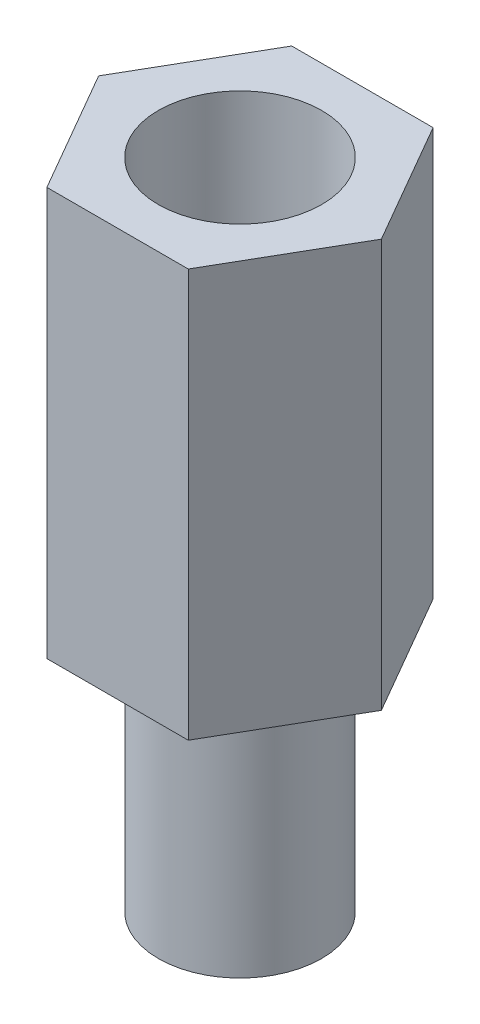
ISO-10303-21;
HEADER;
FILE_DESCRIPTION(('STEP AP214'),'2;1');
FILE_NAME('part.step','',(''),(''),'','','');
FILE_SCHEMA(('AUTOMOTIVE_DESIGN { 1 0 10303 214 1 1 1 1 }'));
ENDSEC;
DATA;
#1=APPLICATION_CONTEXT('core data for automotive mechanical design processes');
#2=APPLICATION_PROTOCOL_DEFINITION('international standard','automotive_design',2000,#1);
#3=PRODUCT_CONTEXT('',#1,'mechanical');
#4=PRODUCT('Part','Part','',(#3));
#5=PRODUCT_RELATED_PRODUCT_CATEGORY('part','',(#4));
#6=PRODUCT_DEFINITION_FORMATION('','',#4);
#7=PRODUCT_DEFINITION_CONTEXT('part definition',#1,'design');
#8=PRODUCT_DEFINITION('design','',#6,#7);
#9=PRODUCT_DEFINITION_SHAPE('','',#8);
#10=(LENGTH_UNIT() NAMED_UNIT(*) SI_UNIT(.MILLI.,.METRE.));
#11=(NAMED_UNIT(*) PLANE_ANGLE_UNIT() SI_UNIT($,.RADIAN.));
#12=(NAMED_UNIT(*) SI_UNIT($,.STERADIAN.) SOLID_ANGLE_UNIT());
#13=UNCERTAINTY_MEASURE_WITH_UNIT(LENGTH_MEASURE(1.E-05),#10,'distance_accuracy_value','');
#14=(GEOMETRIC_REPRESENTATION_CONTEXT(3) GLOBAL_UNCERTAINTY_ASSIGNED_CONTEXT((#13)) GLOBAL_UNIT_ASSIGNED_CONTEXT((#10,
#11,#12)) REPRESENTATION_CONTEXT('',''));
#15=CARTESIAN_POINT('',(0.,0.,0.));
#16=DIRECTION('',(0.,0.,1.));
#17=DIRECTION('',(1.,0.,0.));
#18=AXIS2_PLACEMENT_3D('',#15,#16,#17);
#19=CARTESIAN_POINT('',(0.,-6.,0.));
#20=DIRECTION('',(0.,1.,0.));
#21=DIRECTION('',(0.,0.,1.));
#22=AXIS2_PLACEMENT_3D('',#19,#20,#21);
#23=CYLINDRICAL_SURFACE('',#22,2.);
#24=CARTESIAN_POINT('',(0.,-6.,0.));
#25=DIRECTION('',(0.,1.,0.));
#26=DIRECTION('',(0.,0.,1.));
#27=AXIS2_PLACEMENT_3D('',#24,#25,#26);
#28=CIRCLE('',#27,2.);
#29=CARTESIAN_POINT('',(0.,-6.,2.));
#30=VERTEX_POINT('',#29);
#31=EDGE_CURVE('E11',#30,#30,#28,.T.);
#32=ORIENTED_EDGE('',*,*,#31,.T.);
#33=EDGE_LOOP('',(#32));
#34=FACE_BOUND('',#33,.T.);
#35=CARTESIAN_POINT('',(0.,0.,0.));
#36=DIRECTION('',(0.,1.,0.));
#37=DIRECTION('',(0.,0.,1.));
#38=AXIS2_PLACEMENT_3D('',#35,#36,#37);
#39=CIRCLE('',#38,2.);
#40=CARTESIAN_POINT('',(0.,0.,2.));
#41=VERTEX_POINT('',#40);
#42=EDGE_CURVE('E50',#41,#41,#39,.T.);
#43=ORIENTED_EDGE('',*,*,#42,.F.);
#44=EDGE_LOOP('',(#43));
#45=FACE_BOUND('',#44,.T.);
#46=ADVANCED_FACE('F47',(#34,#45),#23,.T.);
#47=CARTESIAN_POINT('',(0.,-6.,0.));
#48=DIRECTION('',(0.,1.,0.));
#49=DIRECTION('',(0.,0.,1.));
#50=AXIS2_PLACEMENT_3D('',#47,#48,#49);
#51=PLANE('',#50);
#52=ORIENTED_EDGE('',*,*,#31,.F.);
#53=EDGE_LOOP('',(#52));
#54=FACE_BOUND('',#53,.T.);
#55=ADVANCED_FACE('F62',(#54),#51,.F.);
#56=CARTESIAN_POINT('',(0.,0.,0.));
#57=DIRECTION('',(0.,1.,0.));
#58=DIRECTION('',(0.,0.,1.));
#59=AXIS2_PLACEMENT_3D('',#56,#57,#58);
#60=PLANE('',#59);
#61=ORIENTED_EDGE('',*,*,#42,.T.);
#62=EDGE_LOOP('',(#61));
#63=FACE_BOUND('',#62,.T.);
#64=ADVANCED_FACE('F59',(#63),#60,.T.);
#65=CLOSED_SHELL('',(#46,#55,#64));
#66=MANIFOLD_SOLID_BREP('B2',#65);
#67=CARTESIAN_POINT('',(0.,10.,0.));
#68=DIRECTION('',(0.,1.,0.));
#69=DIRECTION('',(0.,0.,1.));
#70=AXIS2_PLACEMENT_3D('',#67,#68,#69);
#71=PLANE('',#70);
#72=DIRECTION('',(0.5,0.,-0.866025403784439));
#73=VECTOR('',#72,1.);
#74=CARTESIAN_POINT('',(1.73205080756889,10.,3.));
#75=LINE('',#74,#73);
#76=CARTESIAN_POINT('',(1.73205080756889,10.,3.));
#77=VERTEX_POINT('',#76);
#78=CARTESIAN_POINT('',(3.46410161513776,10.,0.));
#79=VERTEX_POINT('',#78);
#80=EDGE_CURVE('E195',#77,#79,#75,.T.);
#81=ORIENTED_EDGE('',*,*,#80,.T.);
#82=DIRECTION('',(-0.499999999999999,0.,-0.866025403784439));
#83=VECTOR('',#82,1.);
#84=CARTESIAN_POINT('',(3.46410161513776,10.,0.));
#85=LINE('',#84,#83);
#86=CARTESIAN_POINT('',(1.73205080756888,10.,-3.));
#87=VERTEX_POINT('',#86);
#88=EDGE_CURVE('E143',#79,#87,#85,.T.);
#89=ORIENTED_EDGE('',*,*,#88,.T.);
#90=DIRECTION('',(-1.,0.,0.));
#91=VECTOR('',#90,1.);
#92=CARTESIAN_POINT('',(1.73205080756888,10.,-3.));
#93=LINE('',#92,#91);
#94=CARTESIAN_POINT('',(-1.73205080756888,10.,-3.));
#95=VERTEX_POINT('',#94);
#96=EDGE_CURVE('E156',#87,#95,#93,.T.);
#97=ORIENTED_EDGE('',*,*,#96,.T.);
#98=DIRECTION('',(-0.500000000000001,0.,0.866025403784438));
#99=VECTOR('',#98,1.);
#100=CARTESIAN_POINT('',(-1.73205080756888,10.,-3.));
#101=LINE('',#100,#99);
#102=CARTESIAN_POINT('',(-3.46410161513776,10.,0.));
#103=VERTEX_POINT('',#102);
#104=EDGE_CURVE('E150',#95,#103,#101,.T.);
#105=ORIENTED_EDGE('',*,*,#104,.T.);
#106=DIRECTION('',(0.5,0.,0.866025403784439));
#107=VECTOR('',#106,1.);
#108=CARTESIAN_POINT('',(-3.46410161513776,10.,0.));
#109=LINE('',#108,#107);
#110=CARTESIAN_POINT('',(-1.73205080756888,10.,3.));
#111=VERTEX_POINT('',#110);
#112=EDGE_CURVE('E154',#103,#111,#109,.T.);
#113=ORIENTED_EDGE('',*,*,#112,.T.);
#114=DIRECTION('',(1.,0.,0.));
#115=VECTOR('',#114,1.);
#116=CARTESIAN_POINT('',(-1.73205080756888,10.,3.));
#117=LINE('',#116,#115);
#118=EDGE_CURVE('E106',#111,#77,#117,.T.);
#119=ORIENTED_EDGE('',*,*,#118,.T.);
#120=EDGE_LOOP('',(#81,#89,#97,#105,#113,#119));
#121=FACE_BOUND('',#120,.T.);
#122=CARTESIAN_POINT('',(0.,10.,0.));
#123=DIRECTION('',(0.,1.,0.));
#124=DIRECTION('',(0.,0.,1.));
#125=AXIS2_PLACEMENT_3D('',#122,#123,#124);
#126=CIRCLE('',#125,2.);
#127=CARTESIAN_POINT('',(0.,10.,2.));
#128=VERTEX_POINT('',#127);
#129=EDGE_CURVE('E183',#128,#128,#126,.T.);
#130=ORIENTED_EDGE('',*,*,#129,.F.);
#131=EDGE_LOOP('',(#130));
#132=FACE_BOUND('',#131,.T.);
#133=ADVANCED_FACE('F88',(#121,#132),#71,.T.);
#134=CARTESIAN_POINT('',(0.,0.,0.));
#135=DIRECTION('',(0.,1.,0.));
#136=DIRECTION('',(0.,0.,1.));
#137=AXIS2_PLACEMENT_3D('',#134,#135,#136);
#138=PLANE('',#137);
#139=DIRECTION('',(0.5,0.,-0.866025403784439));
#140=VECTOR('',#139,1.);
#141=CARTESIAN_POINT('',(1.73205080756889,0.,3.));
#142=LINE('',#141,#140);
#143=CARTESIAN_POINT('',(1.73205080756889,0.,3.));
#144=VERTEX_POINT('',#143);
#145=CARTESIAN_POINT('',(3.46410161513776,0.,0.));
#146=VERTEX_POINT('',#145);
#147=EDGE_CURVE('E178',#144,#146,#142,.T.);
#148=ORIENTED_EDGE('',*,*,#147,.F.);
#149=DIRECTION('',(1.,0.,0.));
#150=VECTOR('',#149,1.);
#151=CARTESIAN_POINT('',(-1.73205080756888,0.,3.));
#152=LINE('',#151,#150);
#153=CARTESIAN_POINT('',(-1.73205080756888,0.,3.));
#154=VERTEX_POINT('',#153);
#155=EDGE_CURVE('E135',#154,#144,#152,.T.);
#156=ORIENTED_EDGE('',*,*,#155,.F.);
#157=DIRECTION('',(0.5,0.,0.866025403784439));
#158=VECTOR('',#157,1.);
#159=CARTESIAN_POINT('',(-3.46410161513776,0.,0.));
#160=LINE('',#159,#158);
#161=CARTESIAN_POINT('',(-3.46410161513776,0.,0.));
#162=VERTEX_POINT('',#161);
#163=EDGE_CURVE('E129',#162,#154,#160,.T.);
#164=ORIENTED_EDGE('',*,*,#163,.F.);
#165=DIRECTION('',(-0.500000000000001,0.,0.866025403784438));
#166=VECTOR('',#165,1.);
#167=CARTESIAN_POINT('',(-1.73205080756888,0.,-3.));
#168=LINE('',#167,#166);
#169=CARTESIAN_POINT('',(-1.73205080756888,0.,-3.));
#170=VERTEX_POINT('',#169);
#171=EDGE_CURVE('E165',#170,#162,#168,.T.);
#172=ORIENTED_EDGE('',*,*,#171,.F.);
#173=DIRECTION('',(-1.,0.,0.));
#174=VECTOR('',#173,1.);
#175=CARTESIAN_POINT('',(1.73205080756888,0.,-3.));
#176=LINE('',#175,#174);
#177=CARTESIAN_POINT('',(1.73205080756888,0.,-3.));
#178=VERTEX_POINT('',#177);
#179=EDGE_CURVE('E186',#178,#170,#176,.T.);
#180=ORIENTED_EDGE('',*,*,#179,.F.);
#181=DIRECTION('',(-0.499999999999999,0.,-0.866025403784439));
#182=VECTOR('',#181,1.);
#183=CARTESIAN_POINT('',(3.46410161513776,0.,0.));
#184=LINE('',#183,#182);
#185=EDGE_CURVE('E182',#146,#178,#184,.T.);
#186=ORIENTED_EDGE('',*,*,#185,.F.);
#187=EDGE_LOOP('',(#148,#156,#164,#172,#180,#186));
#188=FACE_BOUND('',#187,.T.);
#189=CARTESIAN_POINT('',(0.,0.,0.));
#190=DIRECTION('',(0.,1.,0.));
#191=DIRECTION('',(0.,0.,1.));
#192=AXIS2_PLACEMENT_3D('',#189,#190,#191);
#193=CIRCLE('',#192,2.);
#194=CARTESIAN_POINT('',(0.,0.,2.));
#195=VERTEX_POINT('',#194);
#196=EDGE_CURVE('E292',#195,#195,#193,.T.);
#197=ORIENTED_EDGE('',*,*,#196,.T.);
#198=EDGE_LOOP('',(#197));
#199=FACE_BOUND('',#198,.T.);
#200=ADVANCED_FACE('F208',(#188,#199),#138,.F.);
#201=CARTESIAN_POINT('',(1.73205080756889,10.,3.));
#202=DIRECTION('',(-0.866025403784439,0.,-0.5));
#203=DIRECTION('',(-0.5,0.,0.866025403784439));
#204=AXIS2_PLACEMENT_3D('',#201,#202,#203);
#205=PLANE('',#204);
#206=ORIENTED_EDGE('',*,*,#147,.T.);
#207=DIRECTION('',(0.,-1.,0.));
#208=VECTOR('',#207,1.);
#209=CARTESIAN_POINT('',(3.46410161513776,10.,0.));
#210=LINE('',#209,#208);
#211=EDGE_CURVE('E45',#79,#146,#210,.T.);
#212=ORIENTED_EDGE('',*,*,#211,.F.);
#213=ORIENTED_EDGE('',*,*,#80,.F.);
#214=DIRECTION('',(0.,-1.,0.));
#215=VECTOR('',#214,1.);
#216=CARTESIAN_POINT('',(1.73205080756889,10.,3.));
#217=LINE('',#216,#215);
#218=EDGE_CURVE('E174',#77,#144,#217,.T.);
#219=ORIENTED_EDGE('',*,*,#218,.T.);
#220=EDGE_LOOP('',(#206,#212,#213,#219));
#221=FACE_BOUND('',#220,.T.);
#222=ADVANCED_FACE('F90',(#221),#205,.F.);
#223=CARTESIAN_POINT('',(3.46410161513776,10.,0.));
#224=DIRECTION('',(-0.866025403784439,0.,0.5));
#225=DIRECTION('',(0.5,0.,0.866025403784439));
#226=AXIS2_PLACEMENT_3D('',#223,#224,#225);
#227=PLANE('',#226);
#228=ORIENTED_EDGE('',*,*,#185,.T.);
#229=DIRECTION('',(0.,-1.,0.));
#230=VECTOR('',#229,1.);
#231=CARTESIAN_POINT('',(1.73205080756888,10.,-3.));
#232=LINE('',#231,#230);
#233=EDGE_CURVE('E98',#87,#178,#232,.T.);
#234=ORIENTED_EDGE('',*,*,#233,.F.);
#235=ORIENTED_EDGE('',*,*,#88,.F.);
#236=ORIENTED_EDGE('',*,*,#211,.T.);
#237=EDGE_LOOP('',(#228,#234,#235,#236));
#238=FACE_BOUND('',#237,.T.);
#239=ADVANCED_FACE('F233',(#238),#227,.F.);
#240=CARTESIAN_POINT('',(1.73205080756888,10.,-3.));
#241=DIRECTION('',(0.,0.,1.));
#242=DIRECTION('',(1.,0.,0.));
#243=AXIS2_PLACEMENT_3D('',#240,#241,#242);
#244=PLANE('',#243);
#245=ORIENTED_EDGE('',*,*,#179,.T.);
#246=DIRECTION('',(0.,-1.,0.));
#247=VECTOR('',#246,1.);
#248=CARTESIAN_POINT('',(-1.73205080756888,10.,-3.));
#249=LINE('',#248,#247);
#250=EDGE_CURVE('E167',#95,#170,#249,.T.);
#251=ORIENTED_EDGE('',*,*,#250,.F.);
#252=ORIENTED_EDGE('',*,*,#96,.F.);
#253=ORIENTED_EDGE('',*,*,#233,.T.);
#254=EDGE_LOOP('',(#245,#251,#252,#253));
#255=FACE_BOUND('',#254,.T.);
#256=ADVANCED_FACE('F205',(#255),#244,.F.);
#257=CARTESIAN_POINT('',(-1.73205080756888,10.,-3.));
#258=DIRECTION('',(0.866025403784438,0.,0.500000000000001));
#259=DIRECTION('',(0.500000000000001,0.,-0.866025403784438));
#260=AXIS2_PLACEMENT_3D('',#257,#258,#259);
#261=PLANE('',#260);
#262=ORIENTED_EDGE('',*,*,#171,.T.);
#263=DIRECTION('',(0.,-1.,0.));
#264=VECTOR('',#263,1.);
#265=CARTESIAN_POINT('',(-3.46410161513776,10.,0.));
#266=LINE('',#265,#264);
#267=EDGE_CURVE('E162',#103,#162,#266,.T.);
#268=ORIENTED_EDGE('',*,*,#267,.F.);
#269=ORIENTED_EDGE('',*,*,#104,.F.);
#270=ORIENTED_EDGE('',*,*,#250,.T.);
#271=EDGE_LOOP('',(#262,#268,#269,#270));
#272=FACE_BOUND('',#271,.T.);
#273=ADVANCED_FACE('F163',(#272),#261,.F.);
#274=CARTESIAN_POINT('',(-3.46410161513776,10.,0.));
#275=DIRECTION('',(0.866025403784439,0.,-0.5));
#276=DIRECTION('',(-0.5,0.,-0.866025403784439));
#277=AXIS2_PLACEMENT_3D('',#274,#275,#276);
#278=PLANE('',#277);
#279=ORIENTED_EDGE('',*,*,#163,.T.);
#280=DIRECTION('',(0.,-1.,0.));
#281=VECTOR('',#280,1.);
#282=CARTESIAN_POINT('',(-1.73205080756888,10.,3.));
#283=LINE('',#282,#281);
#284=EDGE_CURVE('E168',#111,#154,#283,.T.);
#285=ORIENTED_EDGE('',*,*,#284,.F.);
#286=ORIENTED_EDGE('',*,*,#112,.F.);
#287=ORIENTED_EDGE('',*,*,#267,.T.);
#288=EDGE_LOOP('',(#279,#285,#286,#287));
#289=FACE_BOUND('',#288,.T.);
#290=ADVANCED_FACE('F170',(#289),#278,.F.);
#291=CARTESIAN_POINT('',(-1.73205080756888,10.,3.));
#292=DIRECTION('',(0.,0.,-1.));
#293=DIRECTION('',(-1.,0.,0.));
#294=AXIS2_PLACEMENT_3D('',#291,#292,#293);
#295=PLANE('',#294);
#296=ORIENTED_EDGE('',*,*,#155,.T.);
#297=ORIENTED_EDGE('',*,*,#218,.F.);
#298=ORIENTED_EDGE('',*,*,#118,.F.);
#299=ORIENTED_EDGE('',*,*,#284,.T.);
#300=EDGE_LOOP('',(#296,#297,#298,#299));
#301=FACE_BOUND('',#300,.T.);
#302=ADVANCED_FACE('F213',(#301),#295,.F.);
#303=CARTESIAN_POINT('',(0.,10.,0.));
#304=DIRECTION('',(0.,-1.,0.));
#305=DIRECTION('',(0.,0.,-1.));
#306=AXIS2_PLACEMENT_3D('',#303,#304,#305);
#307=CYLINDRICAL_SURFACE('',#306,2.);
#308=ORIENTED_EDGE('',*,*,#129,.T.);
#309=EDGE_LOOP('',(#308));
#310=FACE_BOUND('',#309,.T.);
#311=ORIENTED_EDGE('',*,*,#196,.F.);
#312=EDGE_LOOP('',(#311));
#313=FACE_BOUND('',#312,.T.);
#314=ADVANCED_FACE('F215',(#310,#313),#307,.F.);
#315=CLOSED_SHELL('',(#133,#200,#222,#239,#256,#273,#290,#302,#314));
#316=MANIFOLD_SOLID_BREP('B6',#315);
#317=ADVANCED_BREP_SHAPE_REPRESENTATION('',(#18,#66,#316),#14);
#318=SHAPE_DEFINITION_REPRESENTATION(#9,#317);
ENDSEC;
END-ISO-10303-21;
